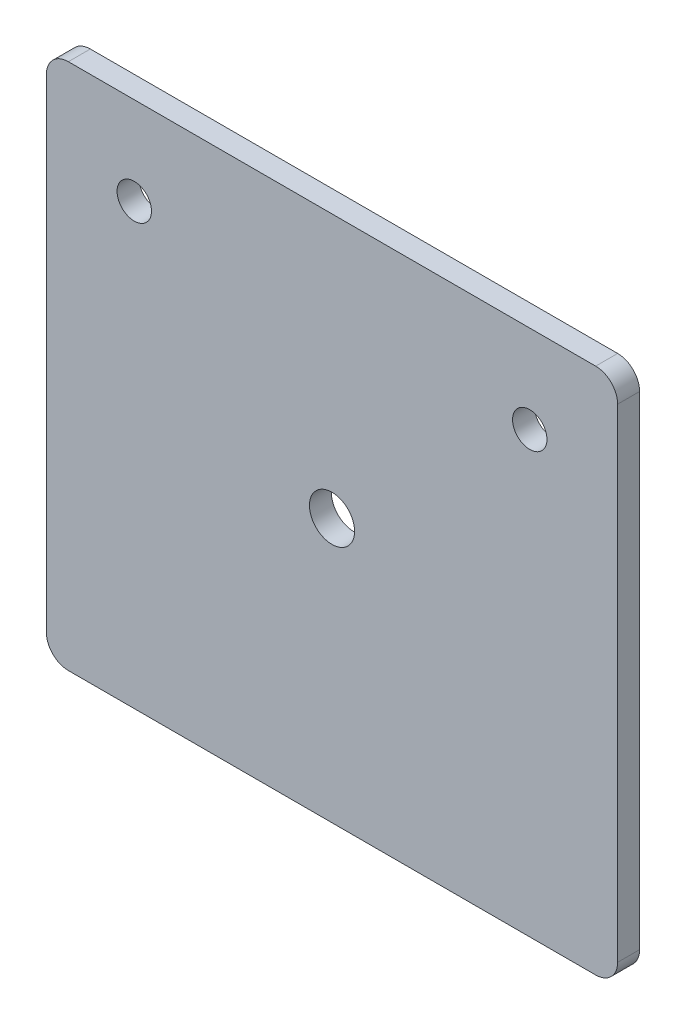
ISO-10303-21;
HEADER;
FILE_DESCRIPTION(('STEP AP214'),'2;1');
FILE_NAME('part.step','',(''),(''),'','','');
FILE_SCHEMA(('AUTOMOTIVE_DESIGN { 1 0 10303 214 1 1 1 1 }'));
ENDSEC;
DATA;
#1=APPLICATION_CONTEXT('core data for automotive mechanical design processes');
#2=APPLICATION_PROTOCOL_DEFINITION('international standard','automotive_design',2000,#1);
#3=PRODUCT_CONTEXT('',#1,'mechanical');
#4=PRODUCT('Part','Part','',(#3));
#5=PRODUCT_RELATED_PRODUCT_CATEGORY('part','',(#4));
#6=PRODUCT_DEFINITION_FORMATION('','',#4);
#7=PRODUCT_DEFINITION_CONTEXT('part definition',#1,'design');
#8=PRODUCT_DEFINITION('design','',#6,#7);
#9=PRODUCT_DEFINITION_SHAPE('','',#8);
#10=(LENGTH_UNIT() NAMED_UNIT(*) SI_UNIT(.MILLI.,.METRE.));
#11=(NAMED_UNIT(*) PLANE_ANGLE_UNIT() SI_UNIT($,.RADIAN.));
#12=(NAMED_UNIT(*) SI_UNIT($,.STERADIAN.) SOLID_ANGLE_UNIT());
#13=UNCERTAINTY_MEASURE_WITH_UNIT(LENGTH_MEASURE(1.E-05),#10,'distance_accuracy_value','');
#14=(GEOMETRIC_REPRESENTATION_CONTEXT(3) GLOBAL_UNCERTAINTY_ASSIGNED_CONTEXT((#13)) GLOBAL_UNIT_ASSIGNED_CONTEXT((#10,
#11,#12)) REPRESENTATION_CONTEXT('',''));
#15=CARTESIAN_POINT('',(0.,0.,0.));
#16=DIRECTION('',(0.,0.,1.));
#17=DIRECTION('',(1.,0.,0.));
#18=AXIS2_PLACEMENT_3D('',#15,#16,#17);
#19=CARTESIAN_POINT('',(0.,-38.1,3.17500000000001));
#20=DIRECTION('',(0.,1.,0.));
#21=DIRECTION('',(0.,0.,1.));
#22=AXIS2_PLACEMENT_3D('',#19,#20,#21);
#23=PLANE('',#22);
#24=DIRECTION('',(1.,0.,0.));
#25=VECTOR('',#24,1.);
#26=CARTESIAN_POINT('',(0.,-38.1,3.17500000000001));
#27=LINE('',#26,#25);
#28=CARTESIAN_POINT('',(-38.1,-38.1,3.17500000000001));
#29=VERTEX_POINT('',#28);
#30=CARTESIAN_POINT('',(38.1,-38.1,3.17500000000001));
#31=VERTEX_POINT('',#30);
#32=EDGE_CURVE('E136',#29,#31,#27,.T.);
#33=ORIENTED_EDGE('',*,*,#32,.F.);
#34=DIRECTION('',(0.,0.,-1.));
#35=VECTOR('',#34,1.);
#36=CARTESIAN_POINT('',(-38.1,-38.1,0.));
#37=LINE('',#36,#35);
#38=CARTESIAN_POINT('',(-38.1,-38.1,0.));
#39=VERTEX_POINT('',#38);
#40=EDGE_CURVE('E120',#29,#39,#37,.T.);
#41=ORIENTED_EDGE('',*,*,#40,.T.);
#42=DIRECTION('',(1.,0.,0.));
#43=VECTOR('',#42,1.);
#44=CARTESIAN_POINT('',(0.,-38.1,0.));
#45=LINE('',#44,#43);
#46=CARTESIAN_POINT('',(38.1,-38.1,0.));
#47=VERTEX_POINT('',#46);
#48=EDGE_CURVE('E133',#39,#47,#45,.T.);
#49=ORIENTED_EDGE('',*,*,#48,.T.);
#50=DIRECTION('',(0.,0.,-1.));
#51=VECTOR('',#50,1.);
#52=CARTESIAN_POINT('',(38.1,-38.1,3.17500000000001));
#53=LINE('',#52,#51);
#54=EDGE_CURVE('E139',#47,#31,#53,.F.);
#55=ORIENTED_EDGE('',*,*,#54,.T.);
#56=EDGE_LOOP('',(#33,#41,#49,#55));
#57=FACE_BOUND('',#56,.T.);
#58=ADVANCED_FACE('F48',(#57),#23,.F.);
#59=CARTESIAN_POINT('',(41.275,0.,3.17500000000001));
#60=DIRECTION('',(-1.,0.,0.));
#61=DIRECTION('',(0.,0.,1.));
#62=AXIS2_PLACEMENT_3D('',#59,#60,#61);
#63=PLANE('',#62);
#64=DIRECTION('',(0.,1.,0.));
#65=VECTOR('',#64,1.);
#66=CARTESIAN_POINT('',(41.275,0.,3.17500000000001));
#67=LINE('',#66,#65);
#68=CARTESIAN_POINT('',(41.275,-34.925,3.17500000000001));
#69=VERTEX_POINT('',#68);
#70=CARTESIAN_POINT('',(41.275,34.925,3.17500000000001));
#71=VERTEX_POINT('',#70);
#72=EDGE_CURVE('E204',#69,#71,#67,.T.);
#73=ORIENTED_EDGE('',*,*,#72,.F.);
#74=DIRECTION('',(0.,0.,-1.));
#75=VECTOR('',#74,1.);
#76=CARTESIAN_POINT('',(41.275,-34.925,3.17500000000001));
#77=LINE('',#76,#75);
#78=CARTESIAN_POINT('',(41.275,-34.925,0.));
#79=VERTEX_POINT('',#78);
#80=EDGE_CURVE('E11',#69,#79,#77,.T.);
#81=ORIENTED_EDGE('',*,*,#80,.T.);
#82=DIRECTION('',(0.,1.,0.));
#83=VECTOR('',#82,1.);
#84=CARTESIAN_POINT('',(41.275,0.,0.));
#85=LINE('',#84,#83);
#86=CARTESIAN_POINT('',(41.275,34.925,0.));
#87=VERTEX_POINT('',#86);
#88=EDGE_CURVE('E145',#79,#87,#85,.T.);
#89=ORIENTED_EDGE('',*,*,#88,.T.);
#90=DIRECTION('',(0.,0.,-1.));
#91=VECTOR('',#90,1.);
#92=CARTESIAN_POINT('',(41.275,34.925,3.17500000000001));
#93=LINE('',#92,#91);
#94=EDGE_CURVE('E57',#87,#71,#93,.F.);
#95=ORIENTED_EDGE('',*,*,#94,.T.);
#96=EDGE_LOOP('',(#73,#81,#89,#95));
#97=FACE_BOUND('',#96,.T.);
#98=ADVANCED_FACE('F203',(#97),#63,.F.);
#99=CARTESIAN_POINT('',(0.,38.1,3.17500000000001));
#100=DIRECTION('',(0.,1.,0.));
#101=DIRECTION('',(0.,0.,1.));
#102=AXIS2_PLACEMENT_3D('',#99,#100,#101);
#103=PLANE('',#102);
#104=DIRECTION('',(1.,0.,0.));
#105=VECTOR('',#104,1.);
#106=CARTESIAN_POINT('',(0.,38.1,0.));
#107=LINE('',#106,#105);
#108=CARTESIAN_POINT('',(-38.1,38.1,0.));
#109=VERTEX_POINT('',#108);
#110=CARTESIAN_POINT('',(38.1,38.1,0.));
#111=VERTEX_POINT('',#110);
#112=EDGE_CURVE('E153',#109,#111,#107,.T.);
#113=ORIENTED_EDGE('',*,*,#112,.F.);
#114=DIRECTION('',(0.,0.,-1.));
#115=VECTOR('',#114,1.);
#116=CARTESIAN_POINT('',(-38.1,38.1,3.17500000000001));
#117=LINE('',#116,#115);
#118=CARTESIAN_POINT('',(-38.1,38.1,3.17500000000001));
#119=VERTEX_POINT('',#118);
#120=EDGE_CURVE('E71',#109,#119,#117,.F.);
#121=ORIENTED_EDGE('',*,*,#120,.T.);
#122=DIRECTION('',(1.,0.,0.));
#123=VECTOR('',#122,1.);
#124=CARTESIAN_POINT('',(0.,38.1,3.17500000000001));
#125=LINE('',#124,#123);
#126=CARTESIAN_POINT('',(38.1,38.1,3.17500000000001));
#127=VERTEX_POINT('',#126);
#128=EDGE_CURVE('E211',#119,#127,#125,.T.);
#129=ORIENTED_EDGE('',*,*,#128,.T.);
#130=DIRECTION('',(0.,0.,-1.));
#131=VECTOR('',#130,1.);
#132=CARTESIAN_POINT('',(38.1,38.1,0.));
#133=LINE('',#132,#131);
#134=EDGE_CURVE('E192',#127,#111,#133,.T.);
#135=ORIENTED_EDGE('',*,*,#134,.T.);
#136=EDGE_LOOP('',(#113,#121,#129,#135));
#137=FACE_BOUND('',#136,.T.);
#138=ADVANCED_FACE('F214',(#137),#103,.T.);
#139=CARTESIAN_POINT('',(-41.275,0.,3.17500000000001));
#140=DIRECTION('',(-1.,0.,0.));
#141=DIRECTION('',(0.,0.,1.));
#142=AXIS2_PLACEMENT_3D('',#139,#140,#141);
#143=PLANE('',#142);
#144=DIRECTION('',(0.,1.,0.));
#145=VECTOR('',#144,1.);
#146=CARTESIAN_POINT('',(-41.275,0.,0.));
#147=LINE('',#146,#145);
#148=CARTESIAN_POINT('',(-41.275,-34.925,0.));
#149=VERTEX_POINT('',#148);
#150=CARTESIAN_POINT('',(-41.275,34.925,0.));
#151=VERTEX_POINT('',#150);
#152=EDGE_CURVE('E165',#149,#151,#147,.T.);
#153=ORIENTED_EDGE('',*,*,#152,.F.);
#154=DIRECTION('',(0.,0.,-1.));
#155=VECTOR('',#154,1.);
#156=CARTESIAN_POINT('',(-41.275,-34.925,3.17500000000001));
#157=LINE('',#156,#155);
#158=CARTESIAN_POINT('',(-41.275,-34.925,3.17500000000001));
#159=VERTEX_POINT('',#158);
#160=EDGE_CURVE('E121',#149,#159,#157,.F.);
#161=ORIENTED_EDGE('',*,*,#160,.T.);
#162=DIRECTION('',(0.,1.,0.));
#163=VECTOR('',#162,1.);
#164=CARTESIAN_POINT('',(-41.275,0.,3.17500000000001));
#165=LINE('',#164,#163);
#166=CARTESIAN_POINT('',(-41.275,34.925,3.17500000000001));
#167=VERTEX_POINT('',#166);
#168=EDGE_CURVE('E159',#159,#167,#165,.T.);
#169=ORIENTED_EDGE('',*,*,#168,.T.);
#170=DIRECTION('',(0.,0.,-1.));
#171=VECTOR('',#170,1.);
#172=CARTESIAN_POINT('',(-41.275,34.925,3.17500000000001));
#173=LINE('',#172,#171);
#174=EDGE_CURVE('E127',#167,#151,#173,.T.);
#175=ORIENTED_EDGE('',*,*,#174,.T.);
#176=EDGE_LOOP('',(#153,#161,#169,#175));
#177=FACE_BOUND('',#176,.T.);
#178=ADVANCED_FACE('F221',(#177),#143,.T.);
#179=CARTESIAN_POINT('',(0.,0.,3.17500000000001));
#180=DIRECTION('',(0.,0.,1.));
#181=DIRECTION('',(1.,0.,0.));
#182=AXIS2_PLACEMENT_3D('',#179,#180,#181);
#183=PLANE('',#182);
#184=CARTESIAN_POINT('',(0.,0.,3.17500000000001));
#185=DIRECTION('',(0.,0.,1.));
#186=DIRECTION('',(1.,0.,0.));
#187=AXIS2_PLACEMENT_3D('',#184,#185,#186);
#188=CIRCLE('',#187,3.2639);
#189=CARTESIAN_POINT('',(3.2639,0.,3.17500000000001));
#190=VERTEX_POINT('',#189);
#191=EDGE_CURVE('E246',#190,#190,#188,.T.);
#192=ORIENTED_EDGE('',*,*,#191,.F.);
#193=EDGE_LOOP('',(#192));
#194=FACE_BOUND('',#193,.T.);
#195=CARTESIAN_POINT('',(-28.575,25.4,3.17500000000001));
#196=DIRECTION('',(0.,0.,1.));
#197=DIRECTION('',(1.,0.,0.));
#198=AXIS2_PLACEMENT_3D('',#195,#196,#197);
#199=CIRCLE('',#198,2.4892);
#200=CARTESIAN_POINT('',(-26.0858,25.4,3.17500000000001));
#201=VERTEX_POINT('',#200);
#202=EDGE_CURVE('E238',#201,#201,#199,.T.);
#203=ORIENTED_EDGE('',*,*,#202,.F.);
#204=EDGE_LOOP('',(#203));
#205=FACE_BOUND('',#204,.T.);
#206=CARTESIAN_POINT('',(28.575,25.4,3.17500000000001));
#207=DIRECTION('',(0.,0.,1.));
#208=DIRECTION('',(1.,0.,0.));
#209=AXIS2_PLACEMENT_3D('',#206,#207,#208);
#210=CIRCLE('',#209,2.4892);
#211=CARTESIAN_POINT('',(31.0642,25.4,3.17500000000001));
#212=VERTEX_POINT('',#211);
#213=EDGE_CURVE('E156',#212,#212,#210,.T.);
#214=ORIENTED_EDGE('',*,*,#213,.F.);
#215=EDGE_LOOP('',(#214));
#216=FACE_BOUND('',#215,.T.);
#217=ORIENTED_EDGE('',*,*,#168,.F.);
#218=CARTESIAN_POINT('',(-38.1,-34.925,3.17500000000001));
#219=DIRECTION('',(0.,0.,1.));
#220=DIRECTION('',(1.,0.,0.));
#221=AXIS2_PLACEMENT_3D('',#218,#219,#220);
#222=CIRCLE('',#221,3.175);
#223=EDGE_CURVE('E189',#159,#29,#222,.T.);
#224=ORIENTED_EDGE('',*,*,#223,.T.);
#225=ORIENTED_EDGE('',*,*,#32,.T.);
#226=CARTESIAN_POINT('',(38.1,-34.925,3.17500000000001));
#227=DIRECTION('',(0.,0.,1.));
#228=DIRECTION('',(1.,0.,0.));
#229=AXIS2_PLACEMENT_3D('',#226,#227,#228);
#230=CIRCLE('',#229,3.175);
#231=EDGE_CURVE('E183',#31,#69,#230,.T.);
#232=ORIENTED_EDGE('',*,*,#231,.T.);
#233=ORIENTED_EDGE('',*,*,#72,.T.);
#234=CARTESIAN_POINT('',(38.1,34.925,3.17500000000001));
#235=DIRECTION('',(0.,0.,1.));
#236=DIRECTION('',(1.,0.,0.));
#237=AXIS2_PLACEMENT_3D('',#234,#235,#236);
#238=CIRCLE('',#237,3.175);
#239=EDGE_CURVE('E64',#71,#127,#238,.T.);
#240=ORIENTED_EDGE('',*,*,#239,.T.);
#241=ORIENTED_EDGE('',*,*,#128,.F.);
#242=CARTESIAN_POINT('',(-38.1,34.925,3.17500000000001));
#243=DIRECTION('',(0.,0.,1.));
#244=DIRECTION('',(1.,0.,0.));
#245=AXIS2_PLACEMENT_3D('',#242,#243,#244);
#246=CIRCLE('',#245,3.175);
#247=EDGE_CURVE('E186',#119,#167,#246,.T.);
#248=ORIENTED_EDGE('',*,*,#247,.T.);
#249=EDGE_LOOP('',(#217,#224,#225,#232,#233,#240,#241,#248));
#250=FACE_BOUND('',#249,.T.);
#251=ADVANCED_FACE('F208',(#194,#205,#216,#250),#183,.T.);
#252=CARTESIAN_POINT('',(0.,0.,0.));
#253=DIRECTION('',(0.,0.,1.));
#254=DIRECTION('',(1.,0.,0.));
#255=AXIS2_PLACEMENT_3D('',#252,#253,#254);
#256=PLANE('',#255);
#257=CARTESIAN_POINT('',(0.,0.,0.));
#258=DIRECTION('',(0.,0.,1.));
#259=DIRECTION('',(1.,0.,0.));
#260=AXIS2_PLACEMENT_3D('',#257,#258,#259);
#261=CIRCLE('',#260,3.2639);
#262=CARTESIAN_POINT('',(3.2639,0.,0.));
#263=VERTEX_POINT('',#262);
#264=EDGE_CURVE('E242',#263,#263,#261,.T.);
#265=ORIENTED_EDGE('',*,*,#264,.T.);
#266=EDGE_LOOP('',(#265));
#267=FACE_BOUND('',#266,.T.);
#268=CARTESIAN_POINT('',(-28.575,25.4,0.));
#269=DIRECTION('',(0.,0.,1.));
#270=DIRECTION('',(1.,0.,0.));
#271=AXIS2_PLACEMENT_3D('',#268,#269,#270);
#272=CIRCLE('',#271,2.4892);
#273=CARTESIAN_POINT('',(-26.0858,25.4,0.));
#274=VERTEX_POINT('',#273);
#275=EDGE_CURVE('E234',#274,#274,#272,.T.);
#276=ORIENTED_EDGE('',*,*,#275,.T.);
#277=EDGE_LOOP('',(#276));
#278=FACE_BOUND('',#277,.T.);
#279=CARTESIAN_POINT('',(28.575,25.4,0.));
#280=DIRECTION('',(0.,0.,1.));
#281=DIRECTION('',(1.,0.,0.));
#282=AXIS2_PLACEMENT_3D('',#279,#280,#281);
#283=CIRCLE('',#282,2.4892);
#284=CARTESIAN_POINT('',(31.0642,25.4,0.));
#285=VERTEX_POINT('',#284);
#286=EDGE_CURVE('E146',#285,#285,#283,.T.);
#287=ORIENTED_EDGE('',*,*,#286,.T.);
#288=EDGE_LOOP('',(#287));
#289=FACE_BOUND('',#288,.T.);
#290=ORIENTED_EDGE('',*,*,#48,.F.);
#291=CARTESIAN_POINT('',(-38.1,-34.925,0.));
#292=DIRECTION('',(0.,0.,1.));
#293=DIRECTION('',(1.,0.,0.));
#294=AXIS2_PLACEMENT_3D('',#291,#292,#293);
#295=CIRCLE('',#294,3.175);
#296=EDGE_CURVE('E116',#39,#149,#295,.F.);
#297=ORIENTED_EDGE('',*,*,#296,.T.);
#298=ORIENTED_EDGE('',*,*,#152,.T.);
#299=CARTESIAN_POINT('',(-38.1,34.925,0.));
#300=DIRECTION('',(0.,0.,1.));
#301=DIRECTION('',(1.,0.,0.));
#302=AXIS2_PLACEMENT_3D('',#299,#300,#301);
#303=CIRCLE('',#302,3.175);
#304=EDGE_CURVE('E128',#151,#109,#303,.F.);
#305=ORIENTED_EDGE('',*,*,#304,.T.);
#306=ORIENTED_EDGE('',*,*,#112,.T.);
#307=CARTESIAN_POINT('',(38.1,34.925,0.));
#308=DIRECTION('',(0.,0.,1.));
#309=DIRECTION('',(1.,0.,0.));
#310=AXIS2_PLACEMENT_3D('',#307,#308,#309);
#311=CIRCLE('',#310,3.175);
#312=EDGE_CURVE('E138',#111,#87,#311,.F.);
#313=ORIENTED_EDGE('',*,*,#312,.T.);
#314=ORIENTED_EDGE('',*,*,#88,.F.);
#315=CARTESIAN_POINT('',(38.1,-34.925,0.));
#316=DIRECTION('',(0.,0.,1.));
#317=DIRECTION('',(1.,0.,0.));
#318=AXIS2_PLACEMENT_3D('',#315,#316,#317);
#319=CIRCLE('',#318,3.175);
#320=EDGE_CURVE('E143',#79,#47,#319,.F.);
#321=ORIENTED_EDGE('',*,*,#320,.T.);
#322=EDGE_LOOP('',(#290,#297,#298,#305,#306,#313,#314,#321));
#323=FACE_BOUND('',#322,.T.);
#324=ADVANCED_FACE('F141',(#267,#278,#289,#323),#256,.F.);
#325=CARTESIAN_POINT('',(28.575,25.4,3.17500000000001));
#326=DIRECTION('',(0.,0.,1.));
#327=DIRECTION('',(1.,0.,0.));
#328=AXIS2_PLACEMENT_3D('',#325,#326,#327);
#329=CYLINDRICAL_SURFACE('',#328,2.4892);
#330=ORIENTED_EDGE('',*,*,#286,.F.);
#331=EDGE_LOOP('',(#330));
#332=FACE_BOUND('',#331,.T.);
#333=ORIENTED_EDGE('',*,*,#213,.T.);
#334=EDGE_LOOP('',(#333));
#335=FACE_BOUND('',#334,.T.);
#336=ADVANCED_FACE('F262',(#332,#335),#329,.F.);
#337=CARTESIAN_POINT('',(-28.575,25.4,3.17500000000001));
#338=DIRECTION('',(0.,0.,1.));
#339=DIRECTION('',(1.,0.,0.));
#340=AXIS2_PLACEMENT_3D('',#337,#338,#339);
#341=CYLINDRICAL_SURFACE('',#340,2.4892);
#342=ORIENTED_EDGE('',*,*,#275,.F.);
#343=EDGE_LOOP('',(#342));
#344=FACE_BOUND('',#343,.T.);
#345=ORIENTED_EDGE('',*,*,#202,.T.);
#346=EDGE_LOOP('',(#345));
#347=FACE_BOUND('',#346,.T.);
#348=ADVANCED_FACE('F264',(#344,#347),#341,.F.);
#349=CARTESIAN_POINT('',(0.,0.,3.17500000000001));
#350=DIRECTION('',(0.,0.,1.));
#351=DIRECTION('',(1.,0.,0.));
#352=AXIS2_PLACEMENT_3D('',#349,#350,#351);
#353=CYLINDRICAL_SURFACE('',#352,3.2639);
#354=ORIENTED_EDGE('',*,*,#264,.F.);
#355=EDGE_LOOP('',(#354));
#356=FACE_BOUND('',#355,.T.);
#357=ORIENTED_EDGE('',*,*,#191,.T.);
#358=EDGE_LOOP('',(#357));
#359=FACE_BOUND('',#358,.T.);
#360=ADVANCED_FACE('F253',(#356,#359),#353,.F.);
#361=CARTESIAN_POINT('',(-38.1,-34.925,3.17500000000001));
#362=DIRECTION('',(0.,0.,1.));
#363=DIRECTION('',(1.,0.,0.));
#364=AXIS2_PLACEMENT_3D('',#361,#362,#363);
#365=CYLINDRICAL_SURFACE('',#364,3.175);
#366=ORIENTED_EDGE('',*,*,#223,.F.);
#367=ORIENTED_EDGE('',*,*,#160,.F.);
#368=ORIENTED_EDGE('',*,*,#296,.F.);
#369=ORIENTED_EDGE('',*,*,#40,.F.);
#370=EDGE_LOOP('',(#366,#367,#368,#369));
#371=FACE_BOUND('',#370,.T.);
#372=ADVANCED_FACE('F119',(#371),#365,.T.);
#373=CARTESIAN_POINT('',(-38.1,34.925,3.17500000000001));
#374=DIRECTION('',(0.,0.,-1.));
#375=DIRECTION('',(-1.,0.,0.));
#376=AXIS2_PLACEMENT_3D('',#373,#374,#375);
#377=CYLINDRICAL_SURFACE('',#376,3.175);
#378=ORIENTED_EDGE('',*,*,#247,.F.);
#379=ORIENTED_EDGE('',*,*,#120,.F.);
#380=ORIENTED_EDGE('',*,*,#304,.F.);
#381=ORIENTED_EDGE('',*,*,#174,.F.);
#382=EDGE_LOOP('',(#378,#379,#380,#381));
#383=FACE_BOUND('',#382,.T.);
#384=ADVANCED_FACE('F218',(#383),#377,.T.);
#385=CARTESIAN_POINT('',(38.1,-34.925,3.17500000000001));
#386=DIRECTION('',(0.,0.,-1.));
#387=DIRECTION('',(-1.,0.,0.));
#388=AXIS2_PLACEMENT_3D('',#385,#386,#387);
#389=CYLINDRICAL_SURFACE('',#388,3.175);
#390=ORIENTED_EDGE('',*,*,#231,.F.);
#391=ORIENTED_EDGE('',*,*,#54,.F.);
#392=ORIENTED_EDGE('',*,*,#320,.F.);
#393=ORIENTED_EDGE('',*,*,#80,.F.);
#394=EDGE_LOOP('',(#390,#391,#392,#393));
#395=FACE_BOUND('',#394,.T.);
#396=ADVANCED_FACE('F287',(#395),#389,.T.);
#397=CARTESIAN_POINT('',(38.1,34.925,3.17500000000001));
#398=DIRECTION('',(0.,0.,1.));
#399=DIRECTION('',(1.,0.,0.));
#400=AXIS2_PLACEMENT_3D('',#397,#398,#399);
#401=CYLINDRICAL_SURFACE('',#400,3.175);
#402=ORIENTED_EDGE('',*,*,#239,.F.);
#403=ORIENTED_EDGE('',*,*,#94,.F.);
#404=ORIENTED_EDGE('',*,*,#312,.F.);
#405=ORIENTED_EDGE('',*,*,#134,.F.);
#406=EDGE_LOOP('',(#402,#403,#404,#405));
#407=FACE_BOUND('',#406,.T.);
#408=ADVANCED_FACE('F50',(#407),#401,.T.);
#409=CLOSED_SHELL('',(#58,#98,#138,#178,#251,#324,#336,#348,#360,#372,#384,#396,#408));
#410=MANIFOLD_SOLID_BREP('B2',#409);
#411=ADVANCED_BREP_SHAPE_REPRESENTATION('',(#18,#410),#14);
#412=SHAPE_DEFINITION_REPRESENTATION(#9,#411);
ENDSEC;
END-ISO-10303-21;
